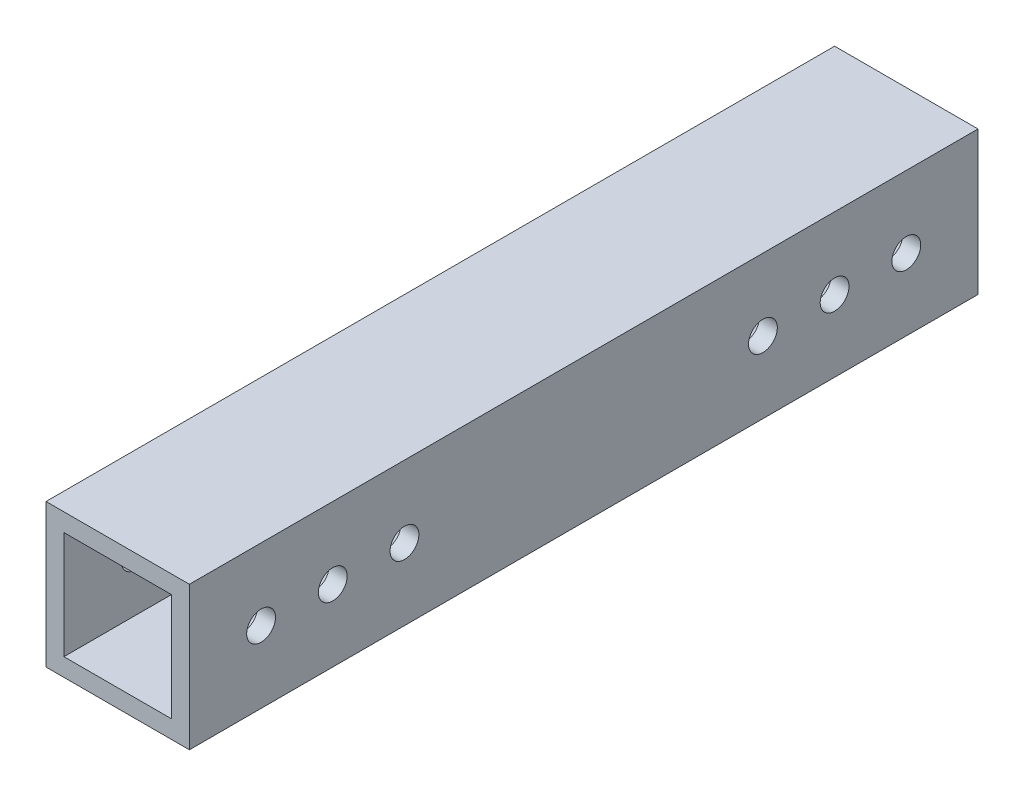
ISO-10303-21;
HEADER;
FILE_DESCRIPTION(('STEP AP214'),'2;1');
FILE_NAME('part.step','',(''),(''),'','','');
FILE_SCHEMA(('AUTOMOTIVE_DESIGN { 1 0 10303 214 1 1 1 1 }'));
ENDSEC;
DATA;
#1=APPLICATION_CONTEXT('core data for automotive mechanical design processes');
#2=APPLICATION_PROTOCOL_DEFINITION('international standard','automotive_design',2000,#1);
#3=PRODUCT_CONTEXT('',#1,'mechanical');
#4=PRODUCT('Part','Part','',(#3));
#5=PRODUCT_RELATED_PRODUCT_CATEGORY('part','',(#4));
#6=PRODUCT_DEFINITION_FORMATION('','',#4);
#7=PRODUCT_DEFINITION_CONTEXT('part definition',#1,'design');
#8=PRODUCT_DEFINITION('design','',#6,#7);
#9=PRODUCT_DEFINITION_SHAPE('','',#8);
#10=(LENGTH_UNIT() NAMED_UNIT(*) SI_UNIT(.MILLI.,.METRE.));
#11=(NAMED_UNIT(*) PLANE_ANGLE_UNIT() SI_UNIT($,.RADIAN.));
#12=(NAMED_UNIT(*) SI_UNIT($,.STERADIAN.) SOLID_ANGLE_UNIT());
#13=UNCERTAINTY_MEASURE_WITH_UNIT(LENGTH_MEASURE(1.E-05),#10,'distance_accuracy_value','');
#14=(GEOMETRIC_REPRESENTATION_CONTEXT(3) GLOBAL_UNCERTAINTY_ASSIGNED_CONTEXT((#13)) GLOBAL_UNIT_ASSIGNED_CONTEXT((#10,
#11,#12)) REPRESENTATION_CONTEXT('',''));
#15=CARTESIAN_POINT('',(0.,0.,0.));
#16=DIRECTION('',(0.,0.,1.));
#17=DIRECTION('',(1.,0.,0.));
#18=AXIS2_PLACEMENT_3D('',#15,#16,#17);
#19=CARTESIAN_POINT('',(0.,0.,139.7));
#20=DIRECTION('',(0.,0.,1.));
#21=DIRECTION('',(1.,0.,0.));
#22=AXIS2_PLACEMENT_3D('',#19,#20,#21);
#23=PLANE('',#22);
#24=DIRECTION('',(0.,1.,0.));
#25=VECTOR('',#24,1.);
#26=CARTESIAN_POINT('',(0.,0.,139.7));
#27=LINE('',#26,#25);
#28=CARTESIAN_POINT('',(0.,0.,139.7));
#29=VERTEX_POINT('',#28);
#30=CARTESIAN_POINT('',(0.,25.4,139.7));
#31=VERTEX_POINT('',#30);
#32=EDGE_CURVE('E180',#29,#31,#27,.T.);
#33=ORIENTED_EDGE('',*,*,#32,.T.);
#34=DIRECTION('',(-1.,0.,0.));
#35=VECTOR('',#34,1.);
#36=CARTESIAN_POINT('',(0.,25.4,139.7));
#37=LINE('',#36,#35);
#38=CARTESIAN_POINT('',(-25.4,25.4,139.7));
#39=VERTEX_POINT('',#38);
#40=EDGE_CURVE('E184',#31,#39,#37,.T.);
#41=ORIENTED_EDGE('',*,*,#40,.T.);
#42=DIRECTION('',(0.,-1.,0.));
#43=VECTOR('',#42,1.);
#44=CARTESIAN_POINT('',(-25.4,0.,139.7));
#45=LINE('',#44,#43);
#46=CARTESIAN_POINT('',(-25.4,0.,139.7));
#47=VERTEX_POINT('',#46);
#48=EDGE_CURVE('E188',#39,#47,#45,.T.);
#49=ORIENTED_EDGE('',*,*,#48,.T.);
#50=DIRECTION('',(1.,0.,0.));
#51=VECTOR('',#50,1.);
#52=CARTESIAN_POINT('',(0.,0.,139.7));
#53=LINE('',#52,#51);
#54=EDGE_CURVE('E191',#47,#29,#53,.T.);
#55=ORIENTED_EDGE('',*,*,#54,.T.);
#56=EDGE_LOOP('',(#33,#41,#49,#55));
#57=FACE_BOUND('',#56,.T.);
#58=DIRECTION('',(-1.,0.,0.));
#59=VECTOR('',#58,1.);
#60=CARTESIAN_POINT('',(0.,22.225,139.7));
#61=LINE('',#60,#59);
#62=CARTESIAN_POINT('',(-3.175,22.225,139.7));
#63=VERTEX_POINT('',#62);
#64=CARTESIAN_POINT('',(-22.225,22.225,139.7));
#65=VERTEX_POINT('',#64);
#66=EDGE_CURVE('E139',#63,#65,#61,.T.);
#67=ORIENTED_EDGE('',*,*,#66,.F.);
#68=DIRECTION('',(0.,1.,0.));
#69=VECTOR('',#68,1.);
#70=CARTESIAN_POINT('',(-3.175,0.,139.7));
#71=LINE('',#70,#69);
#72=CARTESIAN_POINT('',(-3.175,3.175,139.7));
#73=VERTEX_POINT('',#72);
#74=EDGE_CURVE('E130',#73,#63,#71,.T.);
#75=ORIENTED_EDGE('',*,*,#74,.F.);
#76=DIRECTION('',(1.,0.,0.));
#77=VECTOR('',#76,1.);
#78=CARTESIAN_POINT('',(0.,3.175,139.7));
#79=LINE('',#78,#77);
#80=CARTESIAN_POINT('',(-22.225,3.175,139.7));
#81=VERTEX_POINT('',#80);
#82=EDGE_CURVE('E156',#81,#73,#79,.T.);
#83=ORIENTED_EDGE('',*,*,#82,.F.);
#84=DIRECTION('',(0.,-1.,0.));
#85=VECTOR('',#84,1.);
#86=CARTESIAN_POINT('',(-22.225,0.,139.7));
#87=LINE('',#86,#85);
#88=EDGE_CURVE('E152',#65,#81,#87,.T.);
#89=ORIENTED_EDGE('',*,*,#88,.F.);
#90=EDGE_LOOP('',(#67,#75,#83,#89));
#91=FACE_BOUND('',#90,.T.);
#92=ADVANCED_FACE('F62',(#57,#91),#23,.T.);
#93=CARTESIAN_POINT('',(0.,0.,0.));
#94=DIRECTION('',(0.,0.,1.));
#95=DIRECTION('',(1.,0.,0.));
#96=AXIS2_PLACEMENT_3D('',#93,#94,#95);
#97=PLANE('',#96);
#98=DIRECTION('',(0.,1.,0.));
#99=VECTOR('',#98,1.);
#100=CARTESIAN_POINT('',(0.,0.,0.));
#101=LINE('',#100,#99);
#102=CARTESIAN_POINT('',(0.,0.,0.));
#103=VERTEX_POINT('',#102);
#104=CARTESIAN_POINT('',(0.,25.4,0.));
#105=VERTEX_POINT('',#104);
#106=EDGE_CURVE('E148',#103,#105,#101,.T.);
#107=ORIENTED_EDGE('',*,*,#106,.F.);
#108=DIRECTION('',(1.,0.,0.));
#109=VECTOR('',#108,1.);
#110=CARTESIAN_POINT('',(0.,0.,0.));
#111=LINE('',#110,#109);
#112=CARTESIAN_POINT('',(-25.4,0.,0.));
#113=VERTEX_POINT('',#112);
#114=EDGE_CURVE('E185',#113,#103,#111,.T.);
#115=ORIENTED_EDGE('',*,*,#114,.F.);
#116=DIRECTION('',(0.,-1.,0.));
#117=VECTOR('',#116,1.);
#118=CARTESIAN_POINT('',(-25.4,0.,0.));
#119=LINE('',#118,#117);
#120=CARTESIAN_POINT('',(-25.4,25.4,0.));
#121=VERTEX_POINT('',#120);
#122=EDGE_CURVE('E201',#121,#113,#119,.T.);
#123=ORIENTED_EDGE('',*,*,#122,.F.);
#124=DIRECTION('',(-1.,0.,0.));
#125=VECTOR('',#124,1.);
#126=CARTESIAN_POINT('',(0.,25.4,0.));
#127=LINE('',#126,#125);
#128=EDGE_CURVE('E198',#105,#121,#127,.T.);
#129=ORIENTED_EDGE('',*,*,#128,.F.);
#130=EDGE_LOOP('',(#107,#115,#123,#129));
#131=FACE_BOUND('',#130,.T.);
#132=DIRECTION('',(0.,1.,0.));
#133=VECTOR('',#132,1.);
#134=CARTESIAN_POINT('',(-3.175,0.,0.));
#135=LINE('',#134,#133);
#136=CARTESIAN_POINT('',(-3.175,3.175,0.));
#137=VERTEX_POINT('',#136);
#138=CARTESIAN_POINT('',(-3.175,22.225,0.));
#139=VERTEX_POINT('',#138);
#140=EDGE_CURVE('E88',#137,#139,#135,.T.);
#141=ORIENTED_EDGE('',*,*,#140,.T.);
#142=DIRECTION('',(-1.,0.,0.));
#143=VECTOR('',#142,1.);
#144=CARTESIAN_POINT('',(0.,22.225,0.));
#145=LINE('',#144,#143);
#146=CARTESIAN_POINT('',(-22.225,22.225,0.));
#147=VERTEX_POINT('',#146);
#148=EDGE_CURVE('E146',#139,#147,#145,.T.);
#149=ORIENTED_EDGE('',*,*,#148,.T.);
#150=DIRECTION('',(0.,-1.,0.));
#151=VECTOR('',#150,1.);
#152=CARTESIAN_POINT('',(-22.225,0.,0.));
#153=LINE('',#152,#151);
#154=CARTESIAN_POINT('',(-22.225,3.175,0.));
#155=VERTEX_POINT('',#154);
#156=EDGE_CURVE('E167',#147,#155,#153,.T.);
#157=ORIENTED_EDGE('',*,*,#156,.T.);
#158=DIRECTION('',(1.,0.,0.));
#159=VECTOR('',#158,1.);
#160=CARTESIAN_POINT('',(0.,3.175,0.));
#161=LINE('',#160,#159);
#162=EDGE_CURVE('E140',#155,#137,#161,.T.);
#163=ORIENTED_EDGE('',*,*,#162,.T.);
#164=EDGE_LOOP('',(#141,#149,#157,#163));
#165=FACE_BOUND('',#164,.T.);
#166=ADVANCED_FACE('F311',(#131,#165),#97,.F.);
#167=CARTESIAN_POINT('',(0.,0.,139.7));
#168=DIRECTION('',(-1.,0.,0.));
#169=DIRECTION('',(0.,-1.,0.));
#170=AXIS2_PLACEMENT_3D('',#167,#168,#169);
#171=PLANE('',#170);
#172=CARTESIAN_POINT('',(0.,12.7,114.3));
#173=DIRECTION('',(-1.,0.,0.));
#174=DIRECTION('',(0.,0.,1.));
#175=AXIS2_PLACEMENT_3D('',#172,#173,#174);
#176=CIRCLE('',#175,2.5527);
#177=CARTESIAN_POINT('',(0.,12.7,116.8527));
#178=VERTEX_POINT('',#177);
#179=EDGE_CURVE('E364',#178,#178,#176,.T.);
#180=ORIENTED_EDGE('',*,*,#179,.T.);
#181=EDGE_LOOP('',(#180));
#182=FACE_BOUND('',#181,.T.);
#183=CARTESIAN_POINT('',(0.,12.7,127.));
#184=DIRECTION('',(-1.,0.,0.));
#185=DIRECTION('',(0.,0.,1.));
#186=AXIS2_PLACEMENT_3D('',#183,#184,#185);
#187=CIRCLE('',#186,2.5527);
#188=CARTESIAN_POINT('',(0.,12.7,129.5527));
#189=VERTEX_POINT('',#188);
#190=EDGE_CURVE('E242',#189,#189,#187,.T.);
#191=ORIENTED_EDGE('',*,*,#190,.T.);
#192=EDGE_LOOP('',(#191));
#193=FACE_BOUND('',#192,.T.);
#194=CARTESIAN_POINT('',(0.,12.7,101.6));
#195=DIRECTION('',(-1.,0.,0.));
#196=DIRECTION('',(0.,0.,1.));
#197=AXIS2_PLACEMENT_3D('',#194,#195,#196);
#198=CIRCLE('',#197,2.5527);
#199=CARTESIAN_POINT('',(0.,12.7,104.1527));
#200=VERTEX_POINT('',#199);
#201=EDGE_CURVE('E237',#200,#200,#198,.T.);
#202=ORIENTED_EDGE('',*,*,#201,.T.);
#203=EDGE_LOOP('',(#202));
#204=FACE_BOUND('',#203,.T.);
#205=CARTESIAN_POINT('',(0.,12.7,12.7));
#206=DIRECTION('',(1.,0.,0.));
#207=DIRECTION('',(0.,0.,-1.));
#208=AXIS2_PLACEMENT_3D('',#205,#206,#207);
#209=CIRCLE('',#208,2.55269999999999);
#210=CARTESIAN_POINT('',(0.,12.7,10.1473));
#211=VERTEX_POINT('',#210);
#212=EDGE_CURVE('E270',#211,#211,#209,.T.);
#213=ORIENTED_EDGE('',*,*,#212,.F.);
#214=EDGE_LOOP('',(#213));
#215=FACE_BOUND('',#214,.T.);
#216=CARTESIAN_POINT('',(0.,12.7,25.4));
#217=DIRECTION('',(1.,0.,0.));
#218=DIRECTION('',(0.,0.,-1.));
#219=AXIS2_PLACEMENT_3D('',#216,#217,#218);
#220=CIRCLE('',#219,2.55269999999999);
#221=CARTESIAN_POINT('',(0.,12.7,22.8473));
#222=VERTEX_POINT('',#221);
#223=EDGE_CURVE('E280',#222,#222,#220,.T.);
#224=ORIENTED_EDGE('',*,*,#223,.F.);
#225=EDGE_LOOP('',(#224));
#226=FACE_BOUND('',#225,.T.);
#227=CARTESIAN_POINT('',(0.,12.7,38.1));
#228=DIRECTION('',(1.,0.,0.));
#229=DIRECTION('',(0.,0.,-1.));
#230=AXIS2_PLACEMENT_3D('',#227,#228,#229);
#231=CIRCLE('',#230,2.55269999999999);
#232=CARTESIAN_POINT('',(0.,12.7,35.5473));
#233=VERTEX_POINT('',#232);
#234=EDGE_CURVE('E290',#233,#233,#231,.T.);
#235=ORIENTED_EDGE('',*,*,#234,.F.);
#236=EDGE_LOOP('',(#235));
#237=FACE_BOUND('',#236,.T.);
#238=ORIENTED_EDGE('',*,*,#106,.T.);
#239=DIRECTION('',(0.,0.,-1.));
#240=VECTOR('',#239,1.);
#241=CARTESIAN_POINT('',(0.,25.4,139.7));
#242=LINE('',#241,#240);
#243=EDGE_CURVE('E12',#31,#105,#242,.T.);
#244=ORIENTED_EDGE('',*,*,#243,.F.);
#245=ORIENTED_EDGE('',*,*,#32,.F.);
#246=DIRECTION('',(0.,0.,-1.));
#247=VECTOR('',#246,1.);
#248=CARTESIAN_POINT('',(0.,0.,139.7));
#249=LINE('',#248,#247);
#250=EDGE_CURVE('E194',#29,#103,#249,.T.);
#251=ORIENTED_EDGE('',*,*,#250,.T.);
#252=EDGE_LOOP('',(#238,#244,#245,#251));
#253=FACE_BOUND('',#252,.T.);
#254=ADVANCED_FACE('F64',(#182,#193,#204,#215,#226,#237,#253),#171,.F.);
#255=CARTESIAN_POINT('',(0.,25.4,139.7));
#256=DIRECTION('',(0.,-1.,0.));
#257=DIRECTION('',(1.,0.,0.));
#258=AXIS2_PLACEMENT_3D('',#255,#256,#257);
#259=PLANE('',#258);
#260=ORIENTED_EDGE('',*,*,#128,.T.);
#261=DIRECTION('',(0.,0.,-1.));
#262=VECTOR('',#261,1.);
#263=CARTESIAN_POINT('',(-25.4,25.4,139.7));
#264=LINE('',#263,#262);
#265=EDGE_CURVE('E72',#39,#121,#264,.T.);
#266=ORIENTED_EDGE('',*,*,#265,.F.);
#267=ORIENTED_EDGE('',*,*,#40,.F.);
#268=ORIENTED_EDGE('',*,*,#243,.T.);
#269=EDGE_LOOP('',(#260,#266,#267,#268));
#270=FACE_BOUND('',#269,.T.);
#271=ADVANCED_FACE('F338',(#270),#259,.F.);
#272=CARTESIAN_POINT('',(-25.4,0.,139.7));
#273=DIRECTION('',(1.,0.,0.));
#274=DIRECTION('',(0.,0.,-1.));
#275=AXIS2_PLACEMENT_3D('',#272,#273,#274);
#276=PLANE('',#275);
#277=CARTESIAN_POINT('',(-25.4,12.7,114.3));
#278=DIRECTION('',(-1.,0.,0.));
#279=DIRECTION('',(0.,0.,1.));
#280=AXIS2_PLACEMENT_3D('',#277,#278,#279);
#281=CIRCLE('',#280,2.55269999999999);
#282=CARTESIAN_POINT('',(-25.4,12.7,116.8527));
#283=VERTEX_POINT('',#282);
#284=EDGE_CURVE('E414',#283,#283,#281,.T.);
#285=ORIENTED_EDGE('',*,*,#284,.F.);
#286=EDGE_LOOP('',(#285));
#287=FACE_BOUND('',#286,.T.);
#288=CARTESIAN_POINT('',(-25.4,12.7,127.));
#289=DIRECTION('',(-1.,0.,0.));
#290=DIRECTION('',(0.,0.,1.));
#291=AXIS2_PLACEMENT_3D('',#288,#289,#290);
#292=CIRCLE('',#291,2.55269999999999);
#293=CARTESIAN_POINT('',(-25.4,12.7,129.5527));
#294=VERTEX_POINT('',#293);
#295=EDGE_CURVE('E251',#294,#294,#292,.T.);
#296=ORIENTED_EDGE('',*,*,#295,.F.);
#297=EDGE_LOOP('',(#296));
#298=FACE_BOUND('',#297,.T.);
#299=CARTESIAN_POINT('',(-25.4,12.7,101.6));
#300=DIRECTION('',(-1.,0.,0.));
#301=DIRECTION('',(0.,0.,1.));
#302=AXIS2_PLACEMENT_3D('',#299,#300,#301);
#303=CIRCLE('',#302,2.55269999999999);
#304=CARTESIAN_POINT('',(-25.4,12.7,104.1527));
#305=VERTEX_POINT('',#304);
#306=EDGE_CURVE('E248',#305,#305,#303,.T.);
#307=ORIENTED_EDGE('',*,*,#306,.F.);
#308=EDGE_LOOP('',(#307));
#309=FACE_BOUND('',#308,.T.);
#310=CARTESIAN_POINT('',(-25.4,12.7,12.7));
#311=DIRECTION('',(1.,0.,0.));
#312=DIRECTION('',(0.,0.,-1.));
#313=AXIS2_PLACEMENT_3D('',#310,#311,#312);
#314=CIRCLE('',#313,2.5527);
#315=CARTESIAN_POINT('',(-25.4,12.7,10.1473));
#316=VERTEX_POINT('',#315);
#317=EDGE_CURVE('E232',#316,#316,#314,.T.);
#318=ORIENTED_EDGE('',*,*,#317,.T.);
#319=EDGE_LOOP('',(#318));
#320=FACE_BOUND('',#319,.T.);
#321=CARTESIAN_POINT('',(-25.4,12.7,25.4));
#322=DIRECTION('',(1.,0.,0.));
#323=DIRECTION('',(0.,0.,-1.));
#324=AXIS2_PLACEMENT_3D('',#321,#322,#323);
#325=CIRCLE('',#324,2.5527);
#326=CARTESIAN_POINT('',(-25.4,12.7,22.8473));
#327=VERTEX_POINT('',#326);
#328=EDGE_CURVE('E226',#327,#327,#325,.T.);
#329=ORIENTED_EDGE('',*,*,#328,.T.);
#330=EDGE_LOOP('',(#329));
#331=FACE_BOUND('',#330,.T.);
#332=CARTESIAN_POINT('',(-25.4,12.7,38.1));
#333=DIRECTION('',(1.,0.,0.));
#334=DIRECTION('',(0.,0.,-1.));
#335=AXIS2_PLACEMENT_3D('',#332,#333,#334);
#336=CIRCLE('',#335,2.5527);
#337=CARTESIAN_POINT('',(-25.4,12.7,35.5473));
#338=VERTEX_POINT('',#337);
#339=EDGE_CURVE('E220',#338,#338,#336,.T.);
#340=ORIENTED_EDGE('',*,*,#339,.T.);
#341=EDGE_LOOP('',(#340));
#342=FACE_BOUND('',#341,.T.);
#343=ORIENTED_EDGE('',*,*,#122,.T.);
#344=DIRECTION('',(0.,0.,-1.));
#345=VECTOR('',#344,1.);
#346=CARTESIAN_POINT('',(-25.4,0.,139.7));
#347=LINE('',#346,#345);
#348=EDGE_CURVE('E209',#47,#113,#347,.T.);
#349=ORIENTED_EDGE('',*,*,#348,.F.);
#350=ORIENTED_EDGE('',*,*,#48,.F.);
#351=ORIENTED_EDGE('',*,*,#265,.T.);
#352=EDGE_LOOP('',(#343,#349,#350,#351));
#353=FACE_BOUND('',#352,.T.);
#354=ADVANCED_FACE('F335',(#287,#298,#309,#320,#331,#342,#353),#276,.F.);
#355=CARTESIAN_POINT('',(0.,0.,139.7));
#356=DIRECTION('',(0.,1.,0.));
#357=DIRECTION('',(0.,0.,1.));
#358=AXIS2_PLACEMENT_3D('',#355,#356,#357);
#359=PLANE('',#358);
#360=ORIENTED_EDGE('',*,*,#114,.T.);
#361=ORIENTED_EDGE('',*,*,#250,.F.);
#362=ORIENTED_EDGE('',*,*,#54,.F.);
#363=ORIENTED_EDGE('',*,*,#348,.T.);
#364=EDGE_LOOP('',(#360,#361,#362,#363));
#365=FACE_BOUND('',#364,.T.);
#366=ADVANCED_FACE('F332',(#365),#359,.F.);
#367=CARTESIAN_POINT('',(-3.175,0.,139.7));
#368=DIRECTION('',(-1.,0.,0.));
#369=DIRECTION('',(0.,-1.,0.));
#370=AXIS2_PLACEMENT_3D('',#367,#368,#369);
#371=PLANE('',#370);
#372=CARTESIAN_POINT('',(-3.175,12.7,114.3));
#373=DIRECTION('',(-1.,0.,0.));
#374=DIRECTION('',(0.,-1.,0.));
#375=AXIS2_PLACEMENT_3D('',#372,#373,#374);
#376=CIRCLE('',#375,2.55269999999999);
#377=CARTESIAN_POINT('',(-3.175,10.1473,114.3));
#378=VERTEX_POINT('',#377);
#379=EDGE_CURVE('E257',#378,#378,#376,.T.);
#380=ORIENTED_EDGE('',*,*,#379,.F.);
#381=EDGE_LOOP('',(#380));
#382=FACE_BOUND('',#381,.T.);
#383=CARTESIAN_POINT('',(-3.175,12.7,127.));
#384=DIRECTION('',(-1.,0.,0.));
#385=DIRECTION('',(0.,-1.,0.));
#386=AXIS2_PLACEMENT_3D('',#383,#384,#385);
#387=CIRCLE('',#386,2.55269999999999);
#388=CARTESIAN_POINT('',(-3.175,10.1473,127.));
#389=VERTEX_POINT('',#388);
#390=EDGE_CURVE('E238',#389,#389,#387,.T.);
#391=ORIENTED_EDGE('',*,*,#390,.F.);
#392=EDGE_LOOP('',(#391));
#393=FACE_BOUND('',#392,.T.);
#394=CARTESIAN_POINT('',(-3.175,12.7,101.6));
#395=DIRECTION('',(-1.,0.,0.));
#396=DIRECTION('',(0.,-1.,0.));
#397=AXIS2_PLACEMENT_3D('',#394,#395,#396);
#398=CIRCLE('',#397,2.55269999999999);
#399=CARTESIAN_POINT('',(-3.175,10.1473,101.6));
#400=VERTEX_POINT('',#399);
#401=EDGE_CURVE('E233',#400,#400,#398,.T.);
#402=ORIENTED_EDGE('',*,*,#401,.F.);
#403=EDGE_LOOP('',(#402));
#404=FACE_BOUND('',#403,.T.);
#405=CARTESIAN_POINT('',(-3.175,12.7,12.7));
#406=DIRECTION('',(-1.,0.,0.));
#407=DIRECTION('',(0.,-1.,0.));
#408=AXIS2_PLACEMENT_3D('',#405,#406,#407);
#409=CIRCLE('',#408,2.55269999999999);
#410=CARTESIAN_POINT('',(-3.175,10.1473,12.7));
#411=VERTEX_POINT('',#410);
#412=EDGE_CURVE('E231',#411,#411,#409,.T.);
#413=ORIENTED_EDGE('',*,*,#412,.F.);
#414=EDGE_LOOP('',(#413));
#415=FACE_BOUND('',#414,.T.);
#416=CARTESIAN_POINT('',(-3.175,12.7,25.4));
#417=DIRECTION('',(-1.,0.,0.));
#418=DIRECTION('',(0.,-1.,0.));
#419=AXIS2_PLACEMENT_3D('',#416,#417,#418);
#420=CIRCLE('',#419,2.55269999999999);
#421=CARTESIAN_POINT('',(-3.175,10.1473,25.4));
#422=VERTEX_POINT('',#421);
#423=EDGE_CURVE('E225',#422,#422,#420,.T.);
#424=ORIENTED_EDGE('',*,*,#423,.F.);
#425=EDGE_LOOP('',(#424));
#426=FACE_BOUND('',#425,.T.);
#427=CARTESIAN_POINT('',(-3.175,12.7,38.1));
#428=DIRECTION('',(-1.,0.,0.));
#429=DIRECTION('',(0.,-1.,0.));
#430=AXIS2_PLACEMENT_3D('',#427,#428,#429);
#431=CIRCLE('',#430,2.55269999999999);
#432=CARTESIAN_POINT('',(-3.175,10.1473,38.1));
#433=VERTEX_POINT('',#432);
#434=EDGE_CURVE('E216',#433,#433,#431,.T.);
#435=ORIENTED_EDGE('',*,*,#434,.F.);
#436=EDGE_LOOP('',(#435));
#437=FACE_BOUND('',#436,.T.);
#438=ORIENTED_EDGE('',*,*,#140,.F.);
#439=DIRECTION('',(0.,0.,-1.));
#440=VECTOR('',#439,1.);
#441=CARTESIAN_POINT('',(-3.175,3.175,139.7));
#442=LINE('',#441,#440);
#443=EDGE_CURVE('E134',#73,#137,#442,.T.);
#444=ORIENTED_EDGE('',*,*,#443,.F.);
#445=ORIENTED_EDGE('',*,*,#74,.T.);
#446=DIRECTION('',(0.,0.,-1.));
#447=VECTOR('',#446,1.);
#448=CARTESIAN_POINT('',(-3.175,22.225,139.7));
#449=LINE('',#448,#447);
#450=EDGE_CURVE('E133',#63,#139,#449,.T.);
#451=ORIENTED_EDGE('',*,*,#450,.T.);
#452=EDGE_LOOP('',(#438,#444,#445,#451));
#453=FACE_BOUND('',#452,.T.);
#454=ADVANCED_FACE('F132',(#382,#393,#404,#415,#426,#437,#453),#371,.T.);
#455=CARTESIAN_POINT('',(0.,22.225,139.7));
#456=DIRECTION('',(0.,-1.,0.));
#457=DIRECTION('',(1.,0.,0.));
#458=AXIS2_PLACEMENT_3D('',#455,#456,#457);
#459=PLANE('',#458);
#460=ORIENTED_EDGE('',*,*,#148,.F.);
#461=ORIENTED_EDGE('',*,*,#450,.F.);
#462=ORIENTED_EDGE('',*,*,#66,.T.);
#463=DIRECTION('',(0.,0.,-1.));
#464=VECTOR('',#463,1.);
#465=CARTESIAN_POINT('',(-22.225,22.225,139.7));
#466=LINE('',#465,#464);
#467=EDGE_CURVE('E149',#65,#147,#466,.T.);
#468=ORIENTED_EDGE('',*,*,#467,.T.);
#469=EDGE_LOOP('',(#460,#461,#462,#468));
#470=FACE_BOUND('',#469,.T.);
#471=ADVANCED_FACE('F143',(#470),#459,.T.);
#472=CARTESIAN_POINT('',(-22.225,0.,139.7));
#473=DIRECTION('',(1.,0.,0.));
#474=DIRECTION('',(0.,0.,-1.));
#475=AXIS2_PLACEMENT_3D('',#472,#473,#474);
#476=PLANE('',#475);
#477=CARTESIAN_POINT('',(-22.225,12.7,114.3));
#478=DIRECTION('',(1.,0.,0.));
#479=DIRECTION('',(0.,0.,-1.));
#480=AXIS2_PLACEMENT_3D('',#477,#478,#479);
#481=CIRCLE('',#480,2.55269999999999);
#482=CARTESIAN_POINT('',(-22.225,12.7,111.7473));
#483=VERTEX_POINT('',#482);
#484=EDGE_CURVE('E66',#483,#483,#481,.T.);
#485=ORIENTED_EDGE('',*,*,#484,.F.);
#486=EDGE_LOOP('',(#485));
#487=FACE_BOUND('',#486,.T.);
#488=CARTESIAN_POINT('',(-22.225,12.7,127.));
#489=DIRECTION('',(1.,0.,0.));
#490=DIRECTION('',(0.,0.,-1.));
#491=AXIS2_PLACEMENT_3D('',#488,#489,#490);
#492=CIRCLE('',#491,2.55269999999999);
#493=CARTESIAN_POINT('',(-22.225,12.7,124.4473));
#494=VERTEX_POINT('',#493);
#495=EDGE_CURVE('E241',#494,#494,#492,.T.);
#496=ORIENTED_EDGE('',*,*,#495,.F.);
#497=EDGE_LOOP('',(#496));
#498=FACE_BOUND('',#497,.T.);
#499=CARTESIAN_POINT('',(-22.225,12.7,101.6));
#500=DIRECTION('',(1.,0.,0.));
#501=DIRECTION('',(0.,0.,-1.));
#502=AXIS2_PLACEMENT_3D('',#499,#500,#501);
#503=CIRCLE('',#502,2.55269999999999);
#504=CARTESIAN_POINT('',(-22.225,12.7,99.0473));
#505=VERTEX_POINT('',#504);
#506=EDGE_CURVE('E236',#505,#505,#503,.T.);
#507=ORIENTED_EDGE('',*,*,#506,.F.);
#508=EDGE_LOOP('',(#507));
#509=FACE_BOUND('',#508,.T.);
#510=CARTESIAN_POINT('',(-22.225,12.7,12.7));
#511=DIRECTION('',(1.,0.,0.));
#512=DIRECTION('',(0.,0.,-1.));
#513=AXIS2_PLACEMENT_3D('',#510,#511,#512);
#514=CIRCLE('',#513,2.55269999999999);
#515=CARTESIAN_POINT('',(-22.225,12.7,10.1473));
#516=VERTEX_POINT('',#515);
#517=EDGE_CURVE('E227',#516,#516,#514,.T.);
#518=ORIENTED_EDGE('',*,*,#517,.F.);
#519=EDGE_LOOP('',(#518));
#520=FACE_BOUND('',#519,.T.);
#521=CARTESIAN_POINT('',(-22.225,12.7,25.4));
#522=DIRECTION('',(1.,0.,0.));
#523=DIRECTION('',(0.,0.,-1.));
#524=AXIS2_PLACEMENT_3D('',#521,#522,#523);
#525=CIRCLE('',#524,2.55269999999999);
#526=CARTESIAN_POINT('',(-22.225,12.7,22.8473));
#527=VERTEX_POINT('',#526);
#528=EDGE_CURVE('E221',#527,#527,#525,.T.);
#529=ORIENTED_EDGE('',*,*,#528,.F.);
#530=EDGE_LOOP('',(#529));
#531=FACE_BOUND('',#530,.T.);
#532=CARTESIAN_POINT('',(-22.225,12.7,38.1));
#533=DIRECTION('',(1.,0.,0.));
#534=DIRECTION('',(0.,0.,-1.));
#535=AXIS2_PLACEMENT_3D('',#532,#533,#534);
#536=CIRCLE('',#535,2.55269999999999);
#537=CARTESIAN_POINT('',(-22.225,12.7,35.5473));
#538=VERTEX_POINT('',#537);
#539=EDGE_CURVE('E164',#538,#538,#536,.T.);
#540=ORIENTED_EDGE('',*,*,#539,.F.);
#541=EDGE_LOOP('',(#540));
#542=FACE_BOUND('',#541,.T.);
#543=ORIENTED_EDGE('',*,*,#156,.F.);
#544=ORIENTED_EDGE('',*,*,#467,.F.);
#545=ORIENTED_EDGE('',*,*,#88,.T.);
#546=DIRECTION('',(0.,0.,-1.));
#547=VECTOR('',#546,1.);
#548=CARTESIAN_POINT('',(-22.225,3.175,139.7));
#549=LINE('',#548,#547);
#550=EDGE_CURVE('E80',#81,#155,#549,.T.);
#551=ORIENTED_EDGE('',*,*,#550,.T.);
#552=EDGE_LOOP('',(#543,#544,#545,#551));
#553=FACE_BOUND('',#552,.T.);
#554=ADVANCED_FACE('F303',(#487,#498,#509,#520,#531,#542,#553),#476,.T.);
#555=CARTESIAN_POINT('',(0.,3.175,139.7));
#556=DIRECTION('',(0.,1.,0.));
#557=DIRECTION('',(0.,0.,1.));
#558=AXIS2_PLACEMENT_3D('',#555,#556,#557);
#559=PLANE('',#558);
#560=ORIENTED_EDGE('',*,*,#162,.F.);
#561=ORIENTED_EDGE('',*,*,#550,.F.);
#562=ORIENTED_EDGE('',*,*,#82,.T.);
#563=ORIENTED_EDGE('',*,*,#443,.T.);
#564=EDGE_LOOP('',(#560,#561,#562,#563));
#565=FACE_BOUND('',#564,.T.);
#566=ADVANCED_FACE('F306',(#565),#559,.T.);
#567=CARTESIAN_POINT('',(0.,12.7,38.1));
#568=DIRECTION('',(1.,0.,0.));
#569=DIRECTION('',(0.,0.,-1.));
#570=AXIS2_PLACEMENT_3D('',#567,#568,#569);
#571=CYLINDRICAL_SURFACE('',#570,2.55269999999999);
#572=ORIENTED_EDGE('',*,*,#434,.T.);
#573=EDGE_LOOP('',(#572));
#574=FACE_BOUND('',#573,.T.);
#575=ORIENTED_EDGE('',*,*,#234,.T.);
#576=EDGE_LOOP('',(#575));
#577=FACE_BOUND('',#576,.T.);
#578=ADVANCED_FACE('F313',(#574,#577),#571,.F.);
#579=ORIENTED_EDGE('',*,*,#539,.T.);
#580=EDGE_LOOP('',(#579));
#581=FACE_BOUND('',#580,.T.);
#582=ORIENTED_EDGE('',*,*,#339,.F.);
#583=EDGE_LOOP('',(#582));
#584=FACE_BOUND('',#583,.T.);
#585=ADVANCED_FACE('F300',(#581,#584),#571,.F.);
#586=CARTESIAN_POINT('',(0.,12.7,25.4));
#587=DIRECTION('',(1.,0.,0.));
#588=DIRECTION('',(0.,0.,-1.));
#589=AXIS2_PLACEMENT_3D('',#586,#587,#588);
#590=CYLINDRICAL_SURFACE('',#589,2.55269999999999);
#591=ORIENTED_EDGE('',*,*,#528,.T.);
#592=EDGE_LOOP('',(#591));
#593=FACE_BOUND('',#592,.T.);
#594=ORIENTED_EDGE('',*,*,#328,.F.);
#595=EDGE_LOOP('',(#594));
#596=FACE_BOUND('',#595,.T.);
#597=ADVANCED_FACE('F378',(#593,#596),#590,.F.);
#598=ORIENTED_EDGE('',*,*,#423,.T.);
#599=EDGE_LOOP('',(#598));
#600=FACE_BOUND('',#599,.T.);
#601=ORIENTED_EDGE('',*,*,#223,.T.);
#602=EDGE_LOOP('',(#601));
#603=FACE_BOUND('',#602,.T.);
#604=ADVANCED_FACE('F375',(#600,#603),#590,.F.);
#605=CARTESIAN_POINT('',(0.,12.7,12.7));
#606=DIRECTION('',(1.,0.,0.));
#607=DIRECTION('',(0.,0.,-1.));
#608=AXIS2_PLACEMENT_3D('',#605,#606,#607);
#609=CYLINDRICAL_SURFACE('',#608,2.55269999999999);
#610=ORIENTED_EDGE('',*,*,#517,.T.);
#611=EDGE_LOOP('',(#610));
#612=FACE_BOUND('',#611,.T.);
#613=ORIENTED_EDGE('',*,*,#317,.F.);
#614=EDGE_LOOP('',(#613));
#615=FACE_BOUND('',#614,.T.);
#616=ADVANCED_FACE('F377',(#612,#615),#609,.F.);
#617=ORIENTED_EDGE('',*,*,#412,.T.);
#618=EDGE_LOOP('',(#617));
#619=FACE_BOUND('',#618,.T.);
#620=ORIENTED_EDGE('',*,*,#212,.T.);
#621=EDGE_LOOP('',(#620));
#622=FACE_BOUND('',#621,.T.);
#623=ADVANCED_FACE('F385',(#619,#622),#609,.F.);
#624=CARTESIAN_POINT('',(-25.4,12.7,101.6));
#625=DIRECTION('',(-1.,0.,0.));
#626=DIRECTION('',(0.,0.,1.));
#627=AXIS2_PLACEMENT_3D('',#624,#625,#626);
#628=CYLINDRICAL_SURFACE('',#627,2.55269999999999);
#629=ORIENTED_EDGE('',*,*,#401,.T.);
#630=EDGE_LOOP('',(#629));
#631=FACE_BOUND('',#630,.T.);
#632=ORIENTED_EDGE('',*,*,#201,.F.);
#633=EDGE_LOOP('',(#632));
#634=FACE_BOUND('',#633,.T.);
#635=ADVANCED_FACE('F390',(#631,#634),#628,.F.);
#636=ORIENTED_EDGE('',*,*,#506,.T.);
#637=EDGE_LOOP('',(#636));
#638=FACE_BOUND('',#637,.T.);
#639=ORIENTED_EDGE('',*,*,#306,.T.);
#640=EDGE_LOOP('',(#639));
#641=FACE_BOUND('',#640,.T.);
#642=ADVANCED_FACE('F393',(#638,#641),#628,.F.);
#643=CARTESIAN_POINT('',(-25.4,12.7,127.));
#644=DIRECTION('',(-1.,0.,0.));
#645=DIRECTION('',(0.,0.,1.));
#646=AXIS2_PLACEMENT_3D('',#643,#644,#645);
#647=CYLINDRICAL_SURFACE('',#646,2.55269999999999);
#648=ORIENTED_EDGE('',*,*,#390,.T.);
#649=EDGE_LOOP('',(#648));
#650=FACE_BOUND('',#649,.T.);
#651=ORIENTED_EDGE('',*,*,#190,.F.);
#652=EDGE_LOOP('',(#651));
#653=FACE_BOUND('',#652,.T.);
#654=ADVANCED_FACE('F395',(#650,#653),#647,.F.);
#655=ORIENTED_EDGE('',*,*,#495,.T.);
#656=EDGE_LOOP('',(#655));
#657=FACE_BOUND('',#656,.T.);
#658=ORIENTED_EDGE('',*,*,#295,.T.);
#659=EDGE_LOOP('',(#658));
#660=FACE_BOUND('',#659,.T.);
#661=ADVANCED_FACE('F398',(#657,#660),#647,.F.);
#662=CARTESIAN_POINT('',(-25.4,12.7,114.3));
#663=DIRECTION('',(-1.,0.,0.));
#664=DIRECTION('',(0.,0.,1.));
#665=AXIS2_PLACEMENT_3D('',#662,#663,#664);
#666=CYLINDRICAL_SURFACE('',#665,2.55269999999999);
#667=ORIENTED_EDGE('',*,*,#484,.T.);
#668=EDGE_LOOP('',(#667));
#669=FACE_BOUND('',#668,.T.);
#670=ORIENTED_EDGE('',*,*,#284,.T.);
#671=EDGE_LOOP('',(#670));
#672=FACE_BOUND('',#671,.T.);
#673=ADVANCED_FACE('F399',(#669,#672),#666,.F.);
#674=ORIENTED_EDGE('',*,*,#379,.T.);
#675=EDGE_LOOP('',(#674));
#676=FACE_BOUND('',#675,.T.);
#677=ORIENTED_EDGE('',*,*,#179,.F.);
#678=EDGE_LOOP('',(#677));
#679=FACE_BOUND('',#678,.T.);
#680=ADVANCED_FACE('F401',(#676,#679),#666,.F.);
#681=CLOSED_SHELL('',(#92,#166,#254,#271,#354,#366,#454,#471,#554,#566,#578,#585,#597,#604,#616,
#623,#635,#642,#654,#661,#673,#680));
#682=MANIFOLD_SOLID_BREP('B2',#681);
#683=ADVANCED_BREP_SHAPE_REPRESENTATION('',(#18,#682),#14);
#684=SHAPE_DEFINITION_REPRESENTATION(#9,#683);
ENDSEC;
END-ISO-10303-21;
